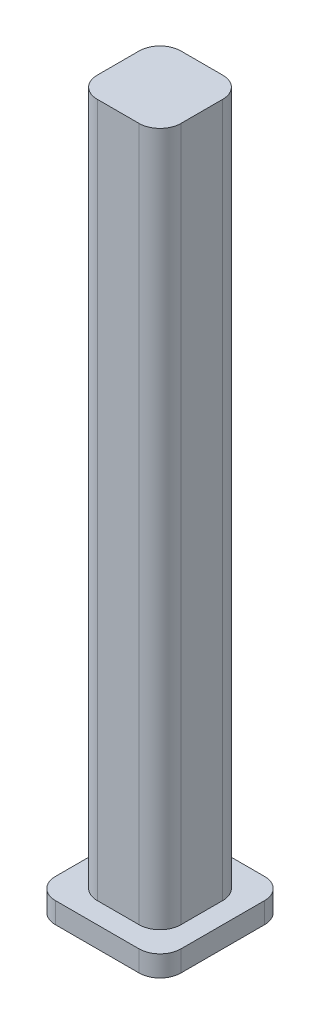
ISO-10303-21;
HEADER;
FILE_DESCRIPTION(('STEP AP214'),'2;1');
FILE_NAME('part.step','',(''),(''),'','','');
FILE_SCHEMA(('AUTOMOTIVE_DESIGN { 1 0 10303 214 1 1 1 1 }'));
ENDSEC;
DATA;
#1=APPLICATION_CONTEXT('core data for automotive mechanical design processes');
#2=APPLICATION_PROTOCOL_DEFINITION('international standard','automotive_design',2000,#1);
#3=PRODUCT_CONTEXT('',#1,'mechanical');
#4=PRODUCT('Part','Part','',(#3));
#5=PRODUCT_RELATED_PRODUCT_CATEGORY('part','',(#4));
#6=PRODUCT_DEFINITION_FORMATION('','',#4);
#7=PRODUCT_DEFINITION_CONTEXT('part definition',#1,'design');
#8=PRODUCT_DEFINITION('design','',#6,#7);
#9=PRODUCT_DEFINITION_SHAPE('','',#8);
#10=(LENGTH_UNIT() NAMED_UNIT(*) SI_UNIT(.MILLI.,.METRE.));
#11=(NAMED_UNIT(*) PLANE_ANGLE_UNIT() SI_UNIT($,.RADIAN.));
#12=(NAMED_UNIT(*) SI_UNIT($,.STERADIAN.) SOLID_ANGLE_UNIT());
#13=UNCERTAINTY_MEASURE_WITH_UNIT(LENGTH_MEASURE(1.E-05),#10,'distance_accuracy_value','');
#14=(GEOMETRIC_REPRESENTATION_CONTEXT(3) GLOBAL_UNCERTAINTY_ASSIGNED_CONTEXT((#13)) GLOBAL_UNIT_ASSIGNED_CONTEXT((#10,
#11,#12)) REPRESENTATION_CONTEXT('',''));
#15=CARTESIAN_POINT('',(0.,0.,0.));
#16=DIRECTION('',(0.,0.,1.));
#17=DIRECTION('',(1.,0.,0.));
#18=AXIS2_PLACEMENT_3D('',#15,#16,#17);
#19=CARTESIAN_POINT('',(0.,10.,0.));
#20=DIRECTION('',(0.,-1.,0.));
#21=DIRECTION('',(0.,0.,-1.));
#22=AXIS2_PLACEMENT_3D('',#19,#20,#21);
#23=PLANE('',#22);
#24=DIRECTION('',(0.,0.,-1.));
#25=VECTOR('',#24,1.);
#26=CARTESIAN_POINT('',(30.,10.,30.));
#27=LINE('',#26,#25);
#28=CARTESIAN_POINT('',(30.,10.,20.));
#29=VERTEX_POINT('',#28);
#30=CARTESIAN_POINT('',(30.,10.,-20.));
#31=VERTEX_POINT('',#30);
#32=EDGE_CURVE('E189',#29,#31,#27,.T.);
#33=ORIENTED_EDGE('',*,*,#32,.T.);
#34=CARTESIAN_POINT('',(20.,10.,-20.));
#35=DIRECTION('',(0.,-1.,0.));
#36=DIRECTION('',(0.,0.,-1.));
#37=AXIS2_PLACEMENT_3D('',#34,#35,#36);
#38=CIRCLE('',#37,10.);
#39=CARTESIAN_POINT('',(20.,10.,-30.));
#40=VERTEX_POINT('',#39);
#41=EDGE_CURVE('E205',#31,#40,#38,.F.);
#42=ORIENTED_EDGE('',*,*,#41,.T.);
#43=DIRECTION('',(-1.,0.,0.));
#44=VECTOR('',#43,1.);
#45=CARTESIAN_POINT('',(-30.,10.,-30.));
#46=LINE('',#45,#44);
#47=CARTESIAN_POINT('',(-20.,10.,-30.));
#48=VERTEX_POINT('',#47);
#49=EDGE_CURVE('E171',#40,#48,#46,.T.);
#50=ORIENTED_EDGE('',*,*,#49,.T.);
#51=CARTESIAN_POINT('',(-20.,10.,-20.));
#52=DIRECTION('',(0.,-1.,0.));
#53=DIRECTION('',(0.,0.,-1.));
#54=AXIS2_PLACEMENT_3D('',#51,#52,#53);
#55=CIRCLE('',#54,10.);
#56=CARTESIAN_POINT('',(-30.,10.,-20.));
#57=VERTEX_POINT('',#56);
#58=EDGE_CURVE('E203',#48,#57,#55,.F.);
#59=ORIENTED_EDGE('',*,*,#58,.T.);
#60=DIRECTION('',(0.,0.,1.));
#61=VECTOR('',#60,1.);
#62=CARTESIAN_POINT('',(-30.,10.,30.));
#63=LINE('',#62,#61);
#64=CARTESIAN_POINT('',(-30.,10.,20.));
#65=VERTEX_POINT('',#64);
#66=EDGE_CURVE('E288',#57,#65,#63,.T.);
#67=ORIENTED_EDGE('',*,*,#66,.T.);
#68=CARTESIAN_POINT('',(-20.,10.,20.));
#69=DIRECTION('',(0.,-1.,0.));
#70=DIRECTION('',(0.,0.,-1.));
#71=AXIS2_PLACEMENT_3D('',#68,#69,#70);
#72=CIRCLE('',#71,10.);
#73=CARTESIAN_POINT('',(-20.,10.,30.));
#74=VERTEX_POINT('',#73);
#75=EDGE_CURVE('E201',#65,#74,#72,.F.);
#76=ORIENTED_EDGE('',*,*,#75,.T.);
#77=DIRECTION('',(1.,0.,0.));
#78=VECTOR('',#77,1.);
#79=CARTESIAN_POINT('',(-30.,10.,30.));
#80=LINE('',#79,#78);
#81=CARTESIAN_POINT('',(20.,10.,30.));
#82=VERTEX_POINT('',#81);
#83=EDGE_CURVE('E190',#74,#82,#80,.T.);
#84=ORIENTED_EDGE('',*,*,#83,.T.);
#85=CARTESIAN_POINT('',(20.,10.,20.));
#86=DIRECTION('',(0.,-1.,0.));
#87=DIRECTION('',(0.,0.,-1.));
#88=AXIS2_PLACEMENT_3D('',#85,#86,#87);
#89=CIRCLE('',#88,10.);
#90=EDGE_CURVE('E199',#82,#29,#89,.F.);
#91=ORIENTED_EDGE('',*,*,#90,.T.);
#92=EDGE_LOOP('',(#33,#42,#50,#59,#67,#76,#84,#91));
#93=FACE_BOUND('',#92,.T.);
#94=DIRECTION('',(0.,0.,-1.));
#95=VECTOR('',#94,1.);
#96=CARTESIAN_POINT('',(20.,10.,0.));
#97=LINE('',#96,#95);
#98=CARTESIAN_POINT('',(20.,10.,10.));
#99=VERTEX_POINT('',#98);
#100=CARTESIAN_POINT('',(20.,10.,-10.));
#101=VERTEX_POINT('',#100);
#102=EDGE_CURVE('E183',#99,#101,#97,.T.);
#103=ORIENTED_EDGE('',*,*,#102,.F.);
#104=CARTESIAN_POINT('',(10.,10.,10.));
#105=DIRECTION('',(0.,-1.,0.));
#106=DIRECTION('',(0.,0.,-1.));
#107=AXIS2_PLACEMENT_3D('',#104,#105,#106);
#108=CIRCLE('',#107,10.);
#109=CARTESIAN_POINT('',(10.,10.,20.));
#110=VERTEX_POINT('',#109);
#111=EDGE_CURVE('E245',#99,#110,#108,.T.);
#112=ORIENTED_EDGE('',*,*,#111,.T.);
#113=DIRECTION('',(1.,0.,0.));
#114=VECTOR('',#113,1.);
#115=CARTESIAN_POINT('',(0.,10.,20.));
#116=LINE('',#115,#114);
#117=CARTESIAN_POINT('',(-10.,10.,20.));
#118=VERTEX_POINT('',#117);
#119=EDGE_CURVE('E275',#118,#110,#116,.T.);
#120=ORIENTED_EDGE('',*,*,#119,.F.);
#121=CARTESIAN_POINT('',(-10.,10.,10.));
#122=DIRECTION('',(0.,-1.,0.));
#123=DIRECTION('',(0.,0.,-1.));
#124=AXIS2_PLACEMENT_3D('',#121,#122,#123);
#125=CIRCLE('',#124,10.);
#126=CARTESIAN_POINT('',(-20.,10.,10.));
#127=VERTEX_POINT('',#126);
#128=EDGE_CURVE('E11',#118,#127,#125,.T.);
#129=ORIENTED_EDGE('',*,*,#128,.T.);
#130=DIRECTION('',(0.,0.,1.));
#131=VECTOR('',#130,1.);
#132=CARTESIAN_POINT('',(-20.,10.,0.));
#133=LINE('',#132,#131);
#134=CARTESIAN_POINT('',(-20.,10.,-9.99999999999999));
#135=VERTEX_POINT('',#134);
#136=EDGE_CURVE('E253',#135,#127,#133,.T.);
#137=ORIENTED_EDGE('',*,*,#136,.F.);
#138=CARTESIAN_POINT('',(-10.,10.,-9.99999999999999));
#139=DIRECTION('',(0.,-1.,0.));
#140=DIRECTION('',(0.,0.,-1.));
#141=AXIS2_PLACEMENT_3D('',#138,#139,#140);
#142=CIRCLE('',#141,10.);
#143=CARTESIAN_POINT('',(-10.,10.,-20.));
#144=VERTEX_POINT('',#143);
#145=EDGE_CURVE('E45',#135,#144,#142,.T.);
#146=ORIENTED_EDGE('',*,*,#145,.T.);
#147=DIRECTION('',(-1.,0.,0.));
#148=VECTOR('',#147,1.);
#149=CARTESIAN_POINT('',(0.,10.,-20.));
#150=LINE('',#149,#148);
#151=CARTESIAN_POINT('',(9.99999999999999,10.,-20.));
#152=VERTEX_POINT('',#151);
#153=EDGE_CURVE('E251',#152,#144,#150,.T.);
#154=ORIENTED_EDGE('',*,*,#153,.F.);
#155=CARTESIAN_POINT('',(9.99999999999999,10.,-10.));
#156=DIRECTION('',(0.,-1.,0.));
#157=DIRECTION('',(0.,0.,-1.));
#158=AXIS2_PLACEMENT_3D('',#155,#156,#157);
#159=CIRCLE('',#158,10.);
#160=EDGE_CURVE('E243',#152,#101,#159,.T.);
#161=ORIENTED_EDGE('',*,*,#160,.T.);
#162=EDGE_LOOP('',(#103,#112,#120,#129,#137,#146,#154,#161));
#163=FACE_BOUND('',#162,.T.);
#164=ADVANCED_FACE('F37',(#93,#163),#23,.F.);
#165=CARTESIAN_POINT('',(30.,10.,30.));
#166=DIRECTION('',(-1.,0.,0.));
#167=DIRECTION('',(0.,0.,1.));
#168=AXIS2_PLACEMENT_3D('',#165,#166,#167);
#169=PLANE('',#168);
#170=DIRECTION('',(0.,0.,-1.));
#171=VECTOR('',#170,1.);
#172=CARTESIAN_POINT('',(30.,0.,30.));
#173=LINE('',#172,#171);
#174=CARTESIAN_POINT('',(30.,0.,20.));
#175=VERTEX_POINT('',#174);
#176=CARTESIAN_POINT('',(30.,0.,-20.));
#177=VERTEX_POINT('',#176);
#178=EDGE_CURVE('E178',#175,#177,#173,.T.);
#179=ORIENTED_EDGE('',*,*,#178,.T.);
#180=DIRECTION('',(0.,-1.,0.));
#181=VECTOR('',#180,1.);
#182=CARTESIAN_POINT('',(30.,10.,-20.));
#183=LINE('',#182,#181);
#184=EDGE_CURVE('E156',#177,#31,#183,.F.);
#185=ORIENTED_EDGE('',*,*,#184,.T.);
#186=ORIENTED_EDGE('',*,*,#32,.F.);
#187=DIRECTION('',(0.,-1.,0.));
#188=VECTOR('',#187,1.);
#189=CARTESIAN_POINT('',(30.,10.,20.));
#190=LINE('',#189,#188);
#191=EDGE_CURVE('E161',#29,#175,#190,.T.);
#192=ORIENTED_EDGE('',*,*,#191,.T.);
#193=EDGE_LOOP('',(#179,#185,#186,#192));
#194=FACE_BOUND('',#193,.T.);
#195=ADVANCED_FACE('F303',(#194),#169,.F.);
#196=CARTESIAN_POINT('',(-30.,10.,-30.));
#197=DIRECTION('',(0.,0.,1.));
#198=DIRECTION('',(1.,0.,0.));
#199=AXIS2_PLACEMENT_3D('',#196,#197,#198);
#200=PLANE('',#199);
#201=ORIENTED_EDGE('',*,*,#49,.F.);
#202=DIRECTION('',(0.,-1.,0.));
#203=VECTOR('',#202,1.);
#204=CARTESIAN_POINT('',(20.,10.,-30.));
#205=LINE('',#204,#203);
#206=CARTESIAN_POINT('',(20.,0.,-30.));
#207=VERTEX_POINT('',#206);
#208=EDGE_CURVE('E155',#40,#207,#205,.T.);
#209=ORIENTED_EDGE('',*,*,#208,.T.);
#210=DIRECTION('',(-1.,0.,0.));
#211=VECTOR('',#210,1.);
#212=CARTESIAN_POINT('',(-30.,0.,-30.));
#213=LINE('',#212,#211);
#214=CARTESIAN_POINT('',(-20.,0.,-30.));
#215=VERTEX_POINT('',#214);
#216=EDGE_CURVE('E168',#207,#215,#213,.T.);
#217=ORIENTED_EDGE('',*,*,#216,.T.);
#218=DIRECTION('',(0.,-1.,0.));
#219=VECTOR('',#218,1.);
#220=CARTESIAN_POINT('',(-20.,10.,-30.));
#221=LINE('',#220,#219);
#222=EDGE_CURVE('E173',#215,#48,#221,.F.);
#223=ORIENTED_EDGE('',*,*,#222,.T.);
#224=EDGE_LOOP('',(#201,#209,#217,#223));
#225=FACE_BOUND('',#224,.T.);
#226=ADVANCED_FACE('F167',(#225),#200,.F.);
#227=CARTESIAN_POINT('',(-30.,10.,30.));
#228=DIRECTION('',(1.,0.,0.));
#229=DIRECTION('',(0.,0.,-1.));
#230=AXIS2_PLACEMENT_3D('',#227,#228,#229);
#231=PLANE('',#230);
#232=ORIENTED_EDGE('',*,*,#66,.F.);
#233=DIRECTION('',(0.,-1.,0.));
#234=VECTOR('',#233,1.);
#235=CARTESIAN_POINT('',(-30.,10.,-20.));
#236=LINE('',#235,#234);
#237=CARTESIAN_POINT('',(-30.,0.,-20.));
#238=VERTEX_POINT('',#237);
#239=EDGE_CURVE('E209',#57,#238,#236,.T.);
#240=ORIENTED_EDGE('',*,*,#239,.T.);
#241=DIRECTION('',(0.,0.,1.));
#242=VECTOR('',#241,1.);
#243=CARTESIAN_POINT('',(-30.,0.,30.));
#244=LINE('',#243,#242);
#245=CARTESIAN_POINT('',(-30.,0.,20.));
#246=VERTEX_POINT('',#245);
#247=EDGE_CURVE('E177',#238,#246,#244,.T.);
#248=ORIENTED_EDGE('',*,*,#247,.T.);
#249=DIRECTION('',(0.,-1.,0.));
#250=VECTOR('',#249,1.);
#251=CARTESIAN_POINT('',(-30.,10.,20.));
#252=LINE('',#251,#250);
#253=EDGE_CURVE('E207',#246,#65,#252,.F.);
#254=ORIENTED_EDGE('',*,*,#253,.T.);
#255=EDGE_LOOP('',(#232,#240,#248,#254));
#256=FACE_BOUND('',#255,.T.);
#257=ADVANCED_FACE('F311',(#256),#231,.F.);
#258=CARTESIAN_POINT('',(-30.,10.,30.));
#259=DIRECTION('',(0.,0.,-1.));
#260=DIRECTION('',(-1.,0.,0.));
#261=AXIS2_PLACEMENT_3D('',#258,#259,#260);
#262=PLANE('',#261);
#263=ORIENTED_EDGE('',*,*,#83,.F.);
#264=DIRECTION('',(0.,-1.,0.));
#265=VECTOR('',#264,1.);
#266=CARTESIAN_POINT('',(-20.,10.,30.));
#267=LINE('',#266,#265);
#268=CARTESIAN_POINT('',(-20.,0.,30.));
#269=VERTEX_POINT('',#268);
#270=EDGE_CURVE('E214',#74,#269,#267,.T.);
#271=ORIENTED_EDGE('',*,*,#270,.T.);
#272=DIRECTION('',(1.,0.,0.));
#273=VECTOR('',#272,1.);
#274=CARTESIAN_POINT('',(-30.,0.,30.));
#275=LINE('',#274,#273);
#276=CARTESIAN_POINT('',(20.,0.,30.));
#277=VERTEX_POINT('',#276);
#278=EDGE_CURVE('E181',#269,#277,#275,.T.);
#279=ORIENTED_EDGE('',*,*,#278,.T.);
#280=DIRECTION('',(0.,-1.,0.));
#281=VECTOR('',#280,1.);
#282=CARTESIAN_POINT('',(20.,10.,30.));
#283=LINE('',#282,#281);
#284=EDGE_CURVE('E212',#277,#82,#283,.F.);
#285=ORIENTED_EDGE('',*,*,#284,.T.);
#286=EDGE_LOOP('',(#263,#271,#279,#285));
#287=FACE_BOUND('',#286,.T.);
#288=ADVANCED_FACE('F305',(#287),#262,.F.);
#289=CARTESIAN_POINT('',(0.,0.,0.));
#290=DIRECTION('',(0.,-1.,0.));
#291=DIRECTION('',(0.,0.,-1.));
#292=AXIS2_PLACEMENT_3D('',#289,#290,#291);
#293=PLANE('',#292);
#294=ORIENTED_EDGE('',*,*,#216,.F.);
#295=CARTESIAN_POINT('',(20.,0.,-20.));
#296=DIRECTION('',(0.,-1.,0.));
#297=DIRECTION('',(0.,0.,-1.));
#298=AXIS2_PLACEMENT_3D('',#295,#296,#297);
#299=CIRCLE('',#298,10.);
#300=EDGE_CURVE('E151',#207,#177,#299,.T.);
#301=ORIENTED_EDGE('',*,*,#300,.T.);
#302=ORIENTED_EDGE('',*,*,#178,.F.);
#303=CARTESIAN_POINT('',(20.,0.,20.));
#304=DIRECTION('',(0.,-1.,0.));
#305=DIRECTION('',(0.,0.,-1.));
#306=AXIS2_PLACEMENT_3D('',#303,#304,#305);
#307=CIRCLE('',#306,10.);
#308=EDGE_CURVE('E172',#175,#277,#307,.T.);
#309=ORIENTED_EDGE('',*,*,#308,.T.);
#310=ORIENTED_EDGE('',*,*,#278,.F.);
#311=CARTESIAN_POINT('',(-20.,0.,20.));
#312=DIRECTION('',(0.,-1.,0.));
#313=DIRECTION('',(0.,0.,-1.));
#314=AXIS2_PLACEMENT_3D('',#311,#312,#313);
#315=CIRCLE('',#314,10.);
#316=EDGE_CURVE('E193',#269,#246,#315,.T.);
#317=ORIENTED_EDGE('',*,*,#316,.T.);
#318=ORIENTED_EDGE('',*,*,#247,.F.);
#319=CARTESIAN_POINT('',(-20.,0.,-20.));
#320=DIRECTION('',(0.,-1.,0.));
#321=DIRECTION('',(0.,0.,-1.));
#322=AXIS2_PLACEMENT_3D('',#319,#320,#321);
#323=CIRCLE('',#322,10.);
#324=EDGE_CURVE('E162',#238,#215,#323,.T.);
#325=ORIENTED_EDGE('',*,*,#324,.T.);
#326=EDGE_LOOP('',(#294,#301,#302,#309,#310,#317,#318,#325));
#327=FACE_BOUND('',#326,.T.);
#328=ADVANCED_FACE('F175',(#327),#293,.T.);
#329=CARTESIAN_POINT('',(20.,341.83195,20.));
#330=DIRECTION('',(-1.,0.,0.));
#331=DIRECTION('',(0.,0.,1.));
#332=AXIS2_PLACEMENT_3D('',#329,#330,#331);
#333=PLANE('',#332);
#334=ORIENTED_EDGE('',*,*,#102,.T.);
#335=DIRECTION('',(0.,-1.,0.));
#336=VECTOR('',#335,1.);
#337=CARTESIAN_POINT('',(20.,341.83195,-9.99999999999999));
#338=LINE('',#337,#336);
#339=CARTESIAN_POINT('',(20.,341.83195,-9.99999999999999));
#340=VERTEX_POINT('',#339);
#341=EDGE_CURVE('E225',#101,#340,#338,.F.);
#342=ORIENTED_EDGE('',*,*,#341,.T.);
#343=DIRECTION('',(0.,0.,-1.));
#344=VECTOR('',#343,1.);
#345=CARTESIAN_POINT('',(20.,341.83195,20.));
#346=LINE('',#345,#344);
#347=CARTESIAN_POINT('',(20.,341.83195,10.));
#348=VERTEX_POINT('',#347);
#349=EDGE_CURVE('E277',#348,#340,#346,.T.);
#350=ORIENTED_EDGE('',*,*,#349,.F.);
#351=DIRECTION('',(0.,-1.,0.));
#352=VECTOR('',#351,1.);
#353=CARTESIAN_POINT('',(20.,341.83195,10.));
#354=LINE('',#353,#352);
#355=EDGE_CURVE('E222',#348,#99,#354,.T.);
#356=ORIENTED_EDGE('',*,*,#355,.T.);
#357=EDGE_LOOP('',(#334,#342,#350,#356));
#358=FACE_BOUND('',#357,.T.);
#359=ADVANCED_FACE('F332',(#358),#333,.F.);
#360=CARTESIAN_POINT('',(-20.,341.83195,-20.));
#361=DIRECTION('',(0.,0.,1.));
#362=DIRECTION('',(1.,0.,0.));
#363=AXIS2_PLACEMENT_3D('',#360,#361,#362);
#364=PLANE('',#363);
#365=DIRECTION('',(-1.,0.,0.));
#366=VECTOR('',#365,1.);
#367=CARTESIAN_POINT('',(-20.,341.83195,-20.));
#368=LINE('',#367,#366);
#369=CARTESIAN_POINT('',(9.99999999999999,341.83195,-20.));
#370=VERTEX_POINT('',#369);
#371=CARTESIAN_POINT('',(-10.,341.83195,-20.));
#372=VERTEX_POINT('',#371);
#373=EDGE_CURVE('E269',#370,#372,#368,.T.);
#374=ORIENTED_EDGE('',*,*,#373,.F.);
#375=DIRECTION('',(0.,-1.,0.));
#376=VECTOR('',#375,1.);
#377=CARTESIAN_POINT('',(9.99999999999999,341.83195,-20.));
#378=LINE('',#377,#376);
#379=EDGE_CURVE('E219',#370,#152,#378,.T.);
#380=ORIENTED_EDGE('',*,*,#379,.T.);
#381=ORIENTED_EDGE('',*,*,#153,.T.);
#382=DIRECTION('',(0.,-1.,0.));
#383=VECTOR('',#382,1.);
#384=CARTESIAN_POINT('',(-10.,341.83195,-20.));
#385=LINE('',#384,#383);
#386=EDGE_CURVE('E217',#144,#372,#385,.F.);
#387=ORIENTED_EDGE('',*,*,#386,.T.);
#388=EDGE_LOOP('',(#374,#380,#381,#387));
#389=FACE_BOUND('',#388,.T.);
#390=ADVANCED_FACE('F259',(#389),#364,.F.);
#391=CARTESIAN_POINT('',(-20.,341.83195,20.));
#392=DIRECTION('',(1.,0.,0.));
#393=DIRECTION('',(0.,0.,-1.));
#394=AXIS2_PLACEMENT_3D('',#391,#392,#393);
#395=PLANE('',#394);
#396=DIRECTION('',(0.,0.,1.));
#397=VECTOR('',#396,1.);
#398=CARTESIAN_POINT('',(-20.,341.83195,20.));
#399=LINE('',#398,#397);
#400=CARTESIAN_POINT('',(-20.,341.83195,-9.99999999999999));
#401=VERTEX_POINT('',#400);
#402=CARTESIAN_POINT('',(-20.,341.83195,10.));
#403=VERTEX_POINT('',#402);
#404=EDGE_CURVE('E268',#401,#403,#399,.T.);
#405=ORIENTED_EDGE('',*,*,#404,.F.);
#406=DIRECTION('',(0.,-1.,0.));
#407=VECTOR('',#406,1.);
#408=CARTESIAN_POINT('',(-20.,341.83195,-9.99999999999999));
#409=LINE('',#408,#407);
#410=EDGE_CURVE('E240',#401,#135,#409,.T.);
#411=ORIENTED_EDGE('',*,*,#410,.T.);
#412=ORIENTED_EDGE('',*,*,#136,.T.);
#413=DIRECTION('',(0.,-1.,0.));
#414=VECTOR('',#413,1.);
#415=CARTESIAN_POINT('',(-20.,341.83195,10.));
#416=LINE('',#415,#414);
#417=EDGE_CURVE('E238',#127,#403,#416,.F.);
#418=ORIENTED_EDGE('',*,*,#417,.T.);
#419=EDGE_LOOP('',(#405,#411,#412,#418));
#420=FACE_BOUND('',#419,.T.);
#421=ADVANCED_FACE('F271',(#420),#395,.F.);
#422=CARTESIAN_POINT('',(-20.,341.83195,20.));
#423=DIRECTION('',(0.,0.,-1.));
#424=DIRECTION('',(-1.,0.,0.));
#425=AXIS2_PLACEMENT_3D('',#422,#423,#424);
#426=PLANE('',#425);
#427=ORIENTED_EDGE('',*,*,#119,.T.);
#428=DIRECTION('',(0.,-1.,0.));
#429=VECTOR('',#428,1.);
#430=CARTESIAN_POINT('',(9.99999999999999,341.83195,20.));
#431=LINE('',#430,#429);
#432=CARTESIAN_POINT('',(9.99999999999999,341.83195,20.));
#433=VERTEX_POINT('',#432);
#434=EDGE_CURVE('E52',#110,#433,#431,.F.);
#435=ORIENTED_EDGE('',*,*,#434,.T.);
#436=DIRECTION('',(1.,0.,0.));
#437=VECTOR('',#436,1.);
#438=CARTESIAN_POINT('',(-20.,341.83195,20.));
#439=LINE('',#438,#437);
#440=CARTESIAN_POINT('',(-10.,341.83195,20.));
#441=VERTEX_POINT('',#440);
#442=EDGE_CURVE('E273',#441,#433,#439,.T.);
#443=ORIENTED_EDGE('',*,*,#442,.F.);
#444=DIRECTION('',(0.,-1.,0.));
#445=VECTOR('',#444,1.);
#446=CARTESIAN_POINT('',(-10.,341.83195,20.));
#447=LINE('',#446,#445);
#448=EDGE_CURVE('E234',#441,#118,#447,.T.);
#449=ORIENTED_EDGE('',*,*,#448,.T.);
#450=EDGE_LOOP('',(#427,#435,#443,#449));
#451=FACE_BOUND('',#450,.T.);
#452=ADVANCED_FACE('F374',(#451),#426,.F.);
#453=CARTESIAN_POINT('',(0.,341.83195,0.));
#454=DIRECTION('',(0.,-1.,0.));
#455=DIRECTION('',(0.,0.,-1.));
#456=AXIS2_PLACEMENT_3D('',#453,#454,#455);
#457=PLANE('',#456);
#458=ORIENTED_EDGE('',*,*,#349,.T.);
#459=CARTESIAN_POINT('',(9.99999999999999,341.83195,-10.));
#460=DIRECTION('',(0.,-1.,0.));
#461=DIRECTION('',(0.,0.,-1.));
#462=AXIS2_PLACEMENT_3D('',#459,#460,#461);
#463=CIRCLE('',#462,10.);
#464=EDGE_CURVE('E232',#340,#370,#463,.F.);
#465=ORIENTED_EDGE('',*,*,#464,.T.);
#466=ORIENTED_EDGE('',*,*,#373,.T.);
#467=CARTESIAN_POINT('',(-10.,341.83195,-9.99999999999999));
#468=DIRECTION('',(0.,-1.,0.));
#469=DIRECTION('',(0.,0.,-1.));
#470=AXIS2_PLACEMENT_3D('',#467,#468,#469);
#471=CIRCLE('',#470,10.);
#472=EDGE_CURVE('E228',#372,#401,#471,.F.);
#473=ORIENTED_EDGE('',*,*,#472,.T.);
#474=ORIENTED_EDGE('',*,*,#404,.T.);
#475=CARTESIAN_POINT('',(-10.,341.83195,10.));
#476=DIRECTION('',(0.,-1.,0.));
#477=DIRECTION('',(0.,0.,-1.));
#478=AXIS2_PLACEMENT_3D('',#475,#476,#477);
#479=CIRCLE('',#478,10.);
#480=EDGE_CURVE('E59',#403,#441,#479,.F.);
#481=ORIENTED_EDGE('',*,*,#480,.T.);
#482=ORIENTED_EDGE('',*,*,#442,.T.);
#483=CARTESIAN_POINT('',(10.,341.83195,10.));
#484=DIRECTION('',(0.,-1.,0.));
#485=DIRECTION('',(0.,0.,-1.));
#486=AXIS2_PLACEMENT_3D('',#483,#484,#485);
#487=CIRCLE('',#486,10.);
#488=EDGE_CURVE('E230',#433,#348,#487,.F.);
#489=ORIENTED_EDGE('',*,*,#488,.T.);
#490=EDGE_LOOP('',(#458,#465,#466,#473,#474,#481,#482,#489));
#491=FACE_BOUND('',#490,.T.);
#492=ADVANCED_FACE('F267',(#491),#457,.F.);
#493=CARTESIAN_POINT('',(20.,10.,-20.));
#494=DIRECTION('',(0.,-1.,0.));
#495=DIRECTION('',(0.,0.,-1.));
#496=AXIS2_PLACEMENT_3D('',#493,#494,#495);
#497=CYLINDRICAL_SURFACE('',#496,10.);
#498=ORIENTED_EDGE('',*,*,#41,.F.);
#499=ORIENTED_EDGE('',*,*,#184,.F.);
#500=ORIENTED_EDGE('',*,*,#300,.F.);
#501=ORIENTED_EDGE('',*,*,#208,.F.);
#502=EDGE_LOOP('',(#498,#499,#500,#501));
#503=FACE_BOUND('',#502,.T.);
#504=ADVANCED_FACE('F154',(#503),#497,.T.);
#505=CARTESIAN_POINT('',(-20.,10.,-20.));
#506=DIRECTION('',(0.,-1.,0.));
#507=DIRECTION('',(0.,0.,-1.));
#508=AXIS2_PLACEMENT_3D('',#505,#506,#507);
#509=CYLINDRICAL_SURFACE('',#508,10.);
#510=ORIENTED_EDGE('',*,*,#58,.F.);
#511=ORIENTED_EDGE('',*,*,#222,.F.);
#512=ORIENTED_EDGE('',*,*,#324,.F.);
#513=ORIENTED_EDGE('',*,*,#239,.F.);
#514=EDGE_LOOP('',(#510,#511,#512,#513));
#515=FACE_BOUND('',#514,.T.);
#516=ADVANCED_FACE('F315',(#515),#509,.T.);
#517=CARTESIAN_POINT('',(-20.,10.,20.));
#518=DIRECTION('',(0.,-1.,0.));
#519=DIRECTION('',(0.,0.,-1.));
#520=AXIS2_PLACEMENT_3D('',#517,#518,#519);
#521=CYLINDRICAL_SURFACE('',#520,10.);
#522=ORIENTED_EDGE('',*,*,#75,.F.);
#523=ORIENTED_EDGE('',*,*,#253,.F.);
#524=ORIENTED_EDGE('',*,*,#316,.F.);
#525=ORIENTED_EDGE('',*,*,#270,.F.);
#526=EDGE_LOOP('',(#522,#523,#524,#525));
#527=FACE_BOUND('',#526,.T.);
#528=ADVANCED_FACE('F307',(#527),#521,.T.);
#529=CARTESIAN_POINT('',(20.,10.,20.));
#530=DIRECTION('',(0.,-1.,0.));
#531=DIRECTION('',(0.,0.,-1.));
#532=AXIS2_PLACEMENT_3D('',#529,#530,#531);
#533=CYLINDRICAL_SURFACE('',#532,10.);
#534=ORIENTED_EDGE('',*,*,#90,.F.);
#535=ORIENTED_EDGE('',*,*,#284,.F.);
#536=ORIENTED_EDGE('',*,*,#308,.F.);
#537=ORIENTED_EDGE('',*,*,#191,.F.);
#538=EDGE_LOOP('',(#534,#535,#536,#537));
#539=FACE_BOUND('',#538,.T.);
#540=ADVANCED_FACE('F301',(#539),#533,.T.);
#541=CARTESIAN_POINT('',(9.99999999999999,341.83195,-10.));
#542=DIRECTION('',(0.,-1.,0.));
#543=DIRECTION('',(0.,0.,-1.));
#544=AXIS2_PLACEMENT_3D('',#541,#542,#543);
#545=CYLINDRICAL_SURFACE('',#544,10.);
#546=ORIENTED_EDGE('',*,*,#464,.F.);
#547=ORIENTED_EDGE('',*,*,#341,.F.);
#548=ORIENTED_EDGE('',*,*,#160,.F.);
#549=ORIENTED_EDGE('',*,*,#379,.F.);
#550=EDGE_LOOP('',(#546,#547,#548,#549));
#551=FACE_BOUND('',#550,.T.);
#552=ADVANCED_FACE('F413',(#551),#545,.T.);
#553=CARTESIAN_POINT('',(10.,341.83195,10.));
#554=DIRECTION('',(0.,-1.,0.));
#555=DIRECTION('',(0.,0.,-1.));
#556=AXIS2_PLACEMENT_3D('',#553,#554,#555);
#557=CYLINDRICAL_SURFACE('',#556,10.);
#558=ORIENTED_EDGE('',*,*,#488,.F.);
#559=ORIENTED_EDGE('',*,*,#434,.F.);
#560=ORIENTED_EDGE('',*,*,#111,.F.);
#561=ORIENTED_EDGE('',*,*,#355,.F.);
#562=EDGE_LOOP('',(#558,#559,#560,#561));
#563=FACE_BOUND('',#562,.T.);
#564=ADVANCED_FACE('F423',(#563),#557,.T.);
#565=CARTESIAN_POINT('',(-10.,341.83195,-9.99999999999999));
#566=DIRECTION('',(0.,-1.,0.));
#567=DIRECTION('',(0.,0.,-1.));
#568=AXIS2_PLACEMENT_3D('',#565,#566,#567);
#569=CYLINDRICAL_SURFACE('',#568,10.);
#570=ORIENTED_EDGE('',*,*,#472,.F.);
#571=ORIENTED_EDGE('',*,*,#386,.F.);
#572=ORIENTED_EDGE('',*,*,#145,.F.);
#573=ORIENTED_EDGE('',*,*,#410,.F.);
#574=EDGE_LOOP('',(#570,#571,#572,#573));
#575=FACE_BOUND('',#574,.T.);
#576=ADVANCED_FACE('F264',(#575),#569,.T.);
#577=CARTESIAN_POINT('',(-10.,341.83195,10.));
#578=DIRECTION('',(0.,-1.,0.));
#579=DIRECTION('',(0.,0.,-1.));
#580=AXIS2_PLACEMENT_3D('',#577,#578,#579);
#581=CYLINDRICAL_SURFACE('',#580,10.);
#582=ORIENTED_EDGE('',*,*,#480,.F.);
#583=ORIENTED_EDGE('',*,*,#417,.F.);
#584=ORIENTED_EDGE('',*,*,#128,.F.);
#585=ORIENTED_EDGE('',*,*,#448,.F.);
#586=EDGE_LOOP('',(#582,#583,#584,#585));
#587=FACE_BOUND('',#586,.T.);
#588=ADVANCED_FACE('F39',(#587),#581,.T.);
#589=CLOSED_SHELL('',(#164,#195,#226,#257,#288,#328,#359,#390,#421,#452,#492,#504,#516,#528,
#540,#552,#564,#576,#588));
#590=MANIFOLD_SOLID_BREP('B2',#589);
#591=ADVANCED_BREP_SHAPE_REPRESENTATION('',(#18,#590),#14);
#592=SHAPE_DEFINITION_REPRESENTATION(#9,#591);
ENDSEC;
END-ISO-10303-21;
